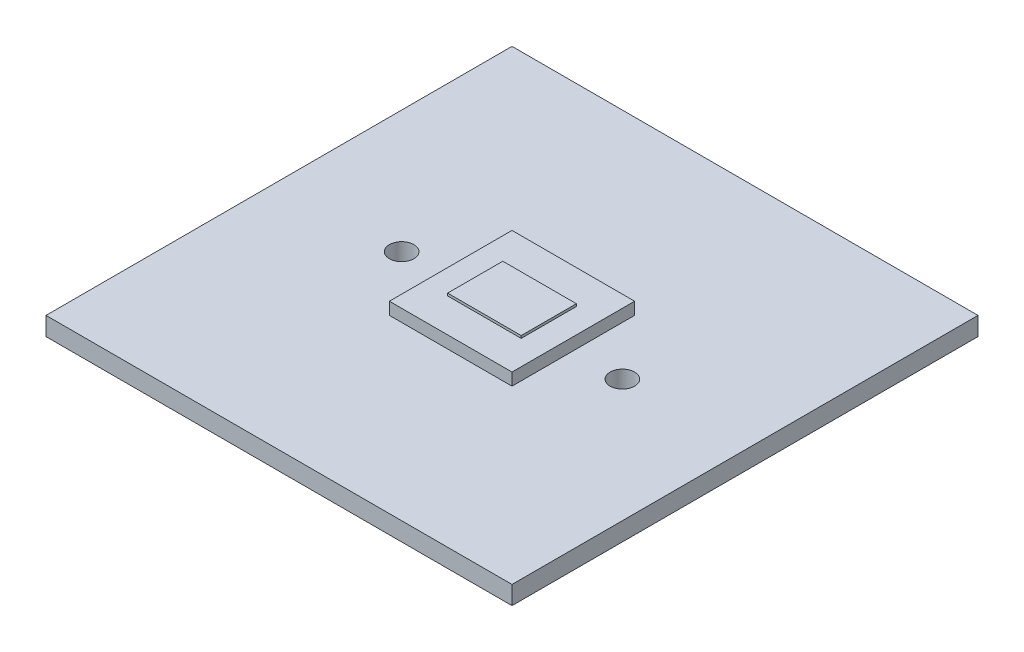
ISO-10303-21;
HEADER;
FILE_DESCRIPTION(('STEP AP214'),'2;1');
FILE_NAME('part.step','',(''),(''),'','','');
FILE_SCHEMA(('AUTOMOTIVE_DESIGN { 1 0 10303 214 1 1 1 1 }'));
ENDSEC;
DATA;
#1=APPLICATION_CONTEXT('core data for automotive mechanical design processes');
#2=APPLICATION_PROTOCOL_DEFINITION('international standard','automotive_design',2000,#1);
#3=PRODUCT_CONTEXT('',#1,'mechanical');
#4=PRODUCT('Part','Part','',(#3));
#5=PRODUCT_RELATED_PRODUCT_CATEGORY('part','',(#4));
#6=PRODUCT_DEFINITION_FORMATION('','',#4);
#7=PRODUCT_DEFINITION_CONTEXT('part definition',#1,'design');
#8=PRODUCT_DEFINITION('design','',#6,#7);
#9=PRODUCT_DEFINITION_SHAPE('','',#8);
#10=(LENGTH_UNIT() NAMED_UNIT(*) SI_UNIT(.MILLI.,.METRE.));
#11=(NAMED_UNIT(*) PLANE_ANGLE_UNIT() SI_UNIT($,.RADIAN.));
#12=(NAMED_UNIT(*) SI_UNIT($,.STERADIAN.) SOLID_ANGLE_UNIT());
#13=UNCERTAINTY_MEASURE_WITH_UNIT(LENGTH_MEASURE(1.E-05),#10,'distance_accuracy_value','');
#14=(GEOMETRIC_REPRESENTATION_CONTEXT(3) GLOBAL_UNCERTAINTY_ASSIGNED_CONTEXT((#13)) GLOBAL_UNIT_ASSIGNED_CONTEXT((#10,
#11,#12)) REPRESENTATION_CONTEXT('',''));
#15=CARTESIAN_POINT('',(0.,0.,0.));
#16=DIRECTION('',(0.,0.,1.));
#17=DIRECTION('',(1.,0.,0.));
#18=AXIS2_PLACEMENT_3D('',#15,#16,#17);
#19=CARTESIAN_POINT('',(0.,1.,0.));
#20=DIRECTION('',(0.,-1.,0.));
#21=DIRECTION('',(0.,0.,-1.));
#22=AXIS2_PLACEMENT_3D('',#19,#20,#21);
#23=PLANE('',#22);
#24=DIRECTION('',(0.,0.,-1.));
#25=VECTOR('',#24,1.);
#26=CARTESIAN_POINT('',(5.,1.,5.));
#27=LINE('',#26,#25);
#28=CARTESIAN_POINT('',(5.,1.,5.));
#29=VERTEX_POINT('',#28);
#30=CARTESIAN_POINT('',(5.,1.,-5.));
#31=VERTEX_POINT('',#30);
#32=EDGE_CURVE('E183',#29,#31,#27,.T.);
#33=ORIENTED_EDGE('',*,*,#32,.T.);
#34=DIRECTION('',(-1.,0.,0.));
#35=VECTOR('',#34,1.);
#36=CARTESIAN_POINT('',(-5.,1.,-5.));
#37=LINE('',#36,#35);
#38=CARTESIAN_POINT('',(-5.,1.,-5.));
#39=VERTEX_POINT('',#38);
#40=EDGE_CURVE('E186',#31,#39,#37,.T.);
#41=ORIENTED_EDGE('',*,*,#40,.T.);
#42=DIRECTION('',(0.,0.,1.));
#43=VECTOR('',#42,1.);
#44=CARTESIAN_POINT('',(-5.,1.,5.));
#45=LINE('',#44,#43);
#46=CARTESIAN_POINT('',(-5.,1.,5.));
#47=VERTEX_POINT('',#46);
#48=EDGE_CURVE('E189',#39,#47,#45,.T.);
#49=ORIENTED_EDGE('',*,*,#48,.T.);
#50=DIRECTION('',(1.,0.,0.));
#51=VECTOR('',#50,1.);
#52=CARTESIAN_POINT('',(-5.,1.,5.));
#53=LINE('',#52,#51);
#54=EDGE_CURVE('E191',#47,#29,#53,.T.);
#55=ORIENTED_EDGE('',*,*,#54,.T.);
#56=EDGE_LOOP('',(#33,#41,#49,#55));
#57=FACE_BOUND('',#56,.T.);
#58=DIRECTION('',(0.,0.,-1.));
#59=VECTOR('',#58,1.);
#60=CARTESIAN_POINT('',(3.,1.,2.25));
#61=LINE('',#60,#59);
#62=CARTESIAN_POINT('',(3.,1.,2.25));
#63=VERTEX_POINT('',#62);
#64=CARTESIAN_POINT('',(3.,1.,-2.25));
#65=VERTEX_POINT('',#64);
#66=EDGE_CURVE('E149',#63,#65,#61,.T.);
#67=ORIENTED_EDGE('',*,*,#66,.F.);
#68=DIRECTION('',(1.,0.,0.));
#69=VECTOR('',#68,1.);
#70=CARTESIAN_POINT('',(-3.,1.,2.25));
#71=LINE('',#70,#69);
#72=CARTESIAN_POINT('',(-3.,1.,2.25));
#73=VERTEX_POINT('',#72);
#74=EDGE_CURVE('E161',#73,#63,#71,.T.);
#75=ORIENTED_EDGE('',*,*,#74,.F.);
#76=DIRECTION('',(0.,0.,1.));
#77=VECTOR('',#76,1.);
#78=CARTESIAN_POINT('',(-3.,1.,2.25));
#79=LINE('',#78,#77);
#80=CARTESIAN_POINT('',(-3.,1.,-2.25));
#81=VERTEX_POINT('',#80);
#82=EDGE_CURVE('E57',#81,#73,#79,.T.);
#83=ORIENTED_EDGE('',*,*,#82,.F.);
#84=DIRECTION('',(-1.,0.,0.));
#85=VECTOR('',#84,1.);
#86=CARTESIAN_POINT('',(-3.,1.,-2.25));
#87=LINE('',#86,#85);
#88=EDGE_CURVE('E52',#65,#81,#87,.T.);
#89=ORIENTED_EDGE('',*,*,#88,.F.);
#90=EDGE_LOOP('',(#67,#75,#83,#89));
#91=FACE_BOUND('',#90,.T.);
#92=ADVANCED_FACE('F37',(#57,#91),#23,.F.);
#93=CARTESIAN_POINT('',(5.,1.,5.));
#94=DIRECTION('',(-1.,0.,0.));
#95=DIRECTION('',(0.,0.,1.));
#96=AXIS2_PLACEMENT_3D('',#93,#94,#95);
#97=PLANE('',#96);
#98=DIRECTION('',(0.,0.,-1.));
#99=VECTOR('',#98,1.);
#100=CARTESIAN_POINT('',(5.,0.,5.));
#101=LINE('',#100,#99);
#102=CARTESIAN_POINT('',(5.,0.,5.));
#103=VERTEX_POINT('',#102);
#104=CARTESIAN_POINT('',(5.,0.,-5.));
#105=VERTEX_POINT('',#104);
#106=EDGE_CURVE('E182',#103,#105,#101,.T.);
#107=ORIENTED_EDGE('',*,*,#106,.T.);
#108=DIRECTION('',(0.,-1.,0.));
#109=VECTOR('',#108,1.);
#110=CARTESIAN_POINT('',(5.,1.,-5.));
#111=LINE('',#110,#109);
#112=EDGE_CURVE('E11',#31,#105,#111,.T.);
#113=ORIENTED_EDGE('',*,*,#112,.F.);
#114=ORIENTED_EDGE('',*,*,#32,.F.);
#115=DIRECTION('',(0.,-1.,0.));
#116=VECTOR('',#115,1.);
#117=CARTESIAN_POINT('',(5.,1.,5.));
#118=LINE('',#117,#116);
#119=EDGE_CURVE('E193',#29,#103,#118,.T.);
#120=ORIENTED_EDGE('',*,*,#119,.T.);
#121=EDGE_LOOP('',(#107,#113,#114,#120));
#122=FACE_BOUND('',#121,.T.);
#123=ADVANCED_FACE('F39',(#122),#97,.F.);
#124=CARTESIAN_POINT('',(-5.,1.,-5.));
#125=DIRECTION('',(0.,0.,1.));
#126=DIRECTION('',(1.,0.,0.));
#127=AXIS2_PLACEMENT_3D('',#124,#125,#126);
#128=PLANE('',#127);
#129=DIRECTION('',(-1.,0.,0.));
#130=VECTOR('',#129,1.);
#131=CARTESIAN_POINT('',(-5.,0.,-5.));
#132=LINE('',#131,#130);
#133=CARTESIAN_POINT('',(-5.,0.,-5.));
#134=VERTEX_POINT('',#133);
#135=EDGE_CURVE('E196',#105,#134,#132,.T.);
#136=ORIENTED_EDGE('',*,*,#135,.T.);
#137=DIRECTION('',(0.,-1.,0.));
#138=VECTOR('',#137,1.);
#139=CARTESIAN_POINT('',(-5.,1.,-5.));
#140=LINE('',#139,#138);
#141=EDGE_CURVE('E45',#39,#134,#140,.T.);
#142=ORIENTED_EDGE('',*,*,#141,.F.);
#143=ORIENTED_EDGE('',*,*,#40,.F.);
#144=ORIENTED_EDGE('',*,*,#112,.T.);
#145=EDGE_LOOP('',(#136,#142,#143,#144));
#146=FACE_BOUND('',#145,.T.);
#147=ADVANCED_FACE('F215',(#146),#128,.F.);
#148=CARTESIAN_POINT('',(-5.,1.,5.));
#149=DIRECTION('',(1.,0.,0.));
#150=DIRECTION('',(0.,0.,-1.));
#151=AXIS2_PLACEMENT_3D('',#148,#149,#150);
#152=PLANE('',#151);
#153=DIRECTION('',(0.,0.,1.));
#154=VECTOR('',#153,1.);
#155=CARTESIAN_POINT('',(-5.,0.,5.));
#156=LINE('',#155,#154);
#157=CARTESIAN_POINT('',(-5.,0.,5.));
#158=VERTEX_POINT('',#157);
#159=EDGE_CURVE('E199',#134,#158,#156,.T.);
#160=ORIENTED_EDGE('',*,*,#159,.T.);
#161=DIRECTION('',(0.,-1.,0.));
#162=VECTOR('',#161,1.);
#163=CARTESIAN_POINT('',(-5.,1.,5.));
#164=LINE('',#163,#162);
#165=EDGE_CURVE('E206',#47,#158,#164,.T.);
#166=ORIENTED_EDGE('',*,*,#165,.F.);
#167=ORIENTED_EDGE('',*,*,#48,.F.);
#168=ORIENTED_EDGE('',*,*,#141,.T.);
#169=EDGE_LOOP('',(#160,#166,#167,#168));
#170=FACE_BOUND('',#169,.T.);
#171=ADVANCED_FACE('F212',(#170),#152,.F.);
#172=CARTESIAN_POINT('',(-5.,1.,5.));
#173=DIRECTION('',(0.,0.,-1.));
#174=DIRECTION('',(-1.,0.,0.));
#175=AXIS2_PLACEMENT_3D('',#172,#173,#174);
#176=PLANE('',#175);
#177=DIRECTION('',(1.,0.,0.));
#178=VECTOR('',#177,1.);
#179=CARTESIAN_POINT('',(-5.,0.,5.));
#180=LINE('',#179,#178);
#181=EDGE_CURVE('E187',#158,#103,#180,.T.);
#182=ORIENTED_EDGE('',*,*,#181,.T.);
#183=ORIENTED_EDGE('',*,*,#119,.F.);
#184=ORIENTED_EDGE('',*,*,#54,.F.);
#185=ORIENTED_EDGE('',*,*,#165,.T.);
#186=EDGE_LOOP('',(#182,#183,#184,#185));
#187=FACE_BOUND('',#186,.T.);
#188=ADVANCED_FACE('F221',(#187),#176,.F.);
#189=CARTESIAN_POINT('',(3.,1.2,2.25));
#190=DIRECTION('',(-1.,0.,0.));
#191=DIRECTION('',(0.,0.,1.));
#192=AXIS2_PLACEMENT_3D('',#189,#190,#191);
#193=PLANE('',#192);
#194=ORIENTED_EDGE('',*,*,#66,.T.);
#195=DIRECTION('',(0.,-1.,0.));
#196=VECTOR('',#195,1.);
#197=CARTESIAN_POINT('',(3.,1.2,-2.25));
#198=LINE('',#197,#196);
#199=CARTESIAN_POINT('',(3.,1.2,-2.25));
#200=VERTEX_POINT('',#199);
#201=EDGE_CURVE('E180',#200,#65,#198,.T.);
#202=ORIENTED_EDGE('',*,*,#201,.F.);
#203=DIRECTION('',(0.,0.,-1.));
#204=VECTOR('',#203,1.);
#205=CARTESIAN_POINT('',(3.,1.2,2.25));
#206=LINE('',#205,#204);
#207=CARTESIAN_POINT('',(3.,1.2,2.25));
#208=VERTEX_POINT('',#207);
#209=EDGE_CURVE('E157',#208,#200,#206,.T.);
#210=ORIENTED_EDGE('',*,*,#209,.F.);
#211=DIRECTION('',(0.,-1.,0.));
#212=VECTOR('',#211,1.);
#213=CARTESIAN_POINT('',(3.,1.2,2.25));
#214=LINE('',#213,#212);
#215=EDGE_CURVE('E166',#208,#63,#214,.T.);
#216=ORIENTED_EDGE('',*,*,#215,.T.);
#217=EDGE_LOOP('',(#194,#202,#210,#216));
#218=FACE_BOUND('',#217,.T.);
#219=ADVANCED_FACE('F236',(#218),#193,.F.);
#220=CARTESIAN_POINT('',(-3.,1.2,-2.25));
#221=DIRECTION('',(0.,0.,1.));
#222=DIRECTION('',(1.,0.,0.));
#223=AXIS2_PLACEMENT_3D('',#220,#221,#222);
#224=PLANE('',#223);
#225=ORIENTED_EDGE('',*,*,#88,.T.);
#226=DIRECTION('',(0.,-1.,0.));
#227=VECTOR('',#226,1.);
#228=CARTESIAN_POINT('',(-3.,1.2,-2.25));
#229=LINE('',#228,#227);
#230=CARTESIAN_POINT('',(-3.,1.2,-2.25));
#231=VERTEX_POINT('',#230);
#232=EDGE_CURVE('E177',#231,#81,#229,.T.);
#233=ORIENTED_EDGE('',*,*,#232,.F.);
#234=DIRECTION('',(-1.,0.,0.));
#235=VECTOR('',#234,1.);
#236=CARTESIAN_POINT('',(-3.,1.2,-2.25));
#237=LINE('',#236,#235);
#238=EDGE_CURVE('E160',#200,#231,#237,.T.);
#239=ORIENTED_EDGE('',*,*,#238,.F.);
#240=ORIENTED_EDGE('',*,*,#201,.T.);
#241=EDGE_LOOP('',(#225,#233,#239,#240));
#242=FACE_BOUND('',#241,.T.);
#243=ADVANCED_FACE('F244',(#242),#224,.F.);
#244=CARTESIAN_POINT('',(-3.,1.2,2.25));
#245=DIRECTION('',(1.,0.,0.));
#246=DIRECTION('',(0.,0.,-1.));
#247=AXIS2_PLACEMENT_3D('',#244,#245,#246);
#248=PLANE('',#247);
#249=ORIENTED_EDGE('',*,*,#82,.T.);
#250=DIRECTION('',(0.,-1.,0.));
#251=VECTOR('',#250,1.);
#252=CARTESIAN_POINT('',(-3.,1.2,2.25));
#253=LINE('',#252,#251);
#254=CARTESIAN_POINT('',(-3.,1.2,2.25));
#255=VERTEX_POINT('',#254);
#256=EDGE_CURVE('E174',#255,#73,#253,.T.);
#257=ORIENTED_EDGE('',*,*,#256,.F.);
#258=DIRECTION('',(0.,0.,1.));
#259=VECTOR('',#258,1.);
#260=CARTESIAN_POINT('',(-3.,1.2,2.25));
#261=LINE('',#260,#259);
#262=EDGE_CURVE('E163',#231,#255,#261,.T.);
#263=ORIENTED_EDGE('',*,*,#262,.F.);
#264=ORIENTED_EDGE('',*,*,#232,.T.);
#265=EDGE_LOOP('',(#249,#257,#263,#264));
#266=FACE_BOUND('',#265,.T.);
#267=ADVANCED_FACE('F242',(#266),#248,.F.);
#268=CARTESIAN_POINT('',(-3.,1.2,2.25));
#269=DIRECTION('',(0.,0.,-1.));
#270=DIRECTION('',(-1.,0.,0.));
#271=AXIS2_PLACEMENT_3D('',#268,#269,#270);
#272=PLANE('',#271);
#273=ORIENTED_EDGE('',*,*,#74,.T.);
#274=ORIENTED_EDGE('',*,*,#215,.F.);
#275=DIRECTION('',(1.,0.,0.));
#276=VECTOR('',#275,1.);
#277=CARTESIAN_POINT('',(-3.,1.2,2.25));
#278=LINE('',#277,#276);
#279=EDGE_CURVE('E165',#255,#208,#278,.T.);
#280=ORIENTED_EDGE('',*,*,#279,.F.);
#281=ORIENTED_EDGE('',*,*,#256,.T.);
#282=EDGE_LOOP('',(#273,#274,#280,#281));
#283=FACE_BOUND('',#282,.T.);
#284=ADVANCED_FACE('F232',(#283),#272,.F.);
#285=CARTESIAN_POINT('',(0.,1.2,0.));
#286=DIRECTION('',(0.,-1.,0.));
#287=DIRECTION('',(0.,0.,-1.));
#288=AXIS2_PLACEMENT_3D('',#285,#286,#287);
#289=PLANE('',#288);
#290=ORIENTED_EDGE('',*,*,#209,.T.);
#291=ORIENTED_EDGE('',*,*,#238,.T.);
#292=ORIENTED_EDGE('',*,*,#262,.T.);
#293=ORIENTED_EDGE('',*,*,#279,.T.);
#294=EDGE_LOOP('',(#290,#291,#292,#293));
#295=FACE_BOUND('',#294,.T.);
#296=ADVANCED_FACE('F238',(#295),#289,.F.);
#297=CARTESIAN_POINT('',(0.,0.,0.));
#298=DIRECTION('',(0.,-1.,0.));
#299=DIRECTION('',(0.,0.,-1.));
#300=AXIS2_PLACEMENT_3D('',#297,#298,#299);
#301=PLANE('',#300);
#302=CARTESIAN_POINT('',(-9.,0.,0.));
#303=DIRECTION('',(0.,1.,0.));
#304=DIRECTION('',(0.,0.,1.));
#305=AXIS2_PLACEMENT_3D('',#302,#303,#304);
#306=CIRCLE('',#305,1.);
#307=CARTESIAN_POINT('',(-9.,0.,1.));
#308=VERTEX_POINT('',#307);
#309=EDGE_CURVE('E409',#308,#308,#306,.T.);
#310=ORIENTED_EDGE('',*,*,#309,.F.);
#311=EDGE_LOOP('',(#310));
#312=FACE_BOUND('',#311,.T.);
#313=CARTESIAN_POINT('',(9.,0.,0.));
#314=DIRECTION('',(0.,1.,0.));
#315=DIRECTION('',(0.,0.,1.));
#316=AXIS2_PLACEMENT_3D('',#313,#314,#315);
#317=CIRCLE('',#316,1.);
#318=CARTESIAN_POINT('',(9.,0.,1.));
#319=VERTEX_POINT('',#318);
#320=EDGE_CURVE('E411',#319,#319,#317,.T.);
#321=ORIENTED_EDGE('',*,*,#320,.F.);
#322=EDGE_LOOP('',(#321));
#323=FACE_BOUND('',#322,.T.);
#324=DIRECTION('',(0.,0.,1.));
#325=VECTOR('',#324,1.);
#326=CARTESIAN_POINT('',(19.,0.,19.));
#327=LINE('',#326,#325);
#328=CARTESIAN_POINT('',(19.,0.,-19.));
#329=VERTEX_POINT('',#328);
#330=CARTESIAN_POINT('',(19.,0.,19.));
#331=VERTEX_POINT('',#330);
#332=EDGE_CURVE('E148',#329,#331,#327,.T.);
#333=ORIENTED_EDGE('',*,*,#332,.F.);
#334=DIRECTION('',(1.,0.,0.));
#335=VECTOR('',#334,1.);
#336=CARTESIAN_POINT('',(-19.,0.,-19.));
#337=LINE('',#336,#335);
#338=CARTESIAN_POINT('',(-19.,0.,-19.));
#339=VERTEX_POINT('',#338);
#340=EDGE_CURVE('E144',#339,#329,#337,.T.);
#341=ORIENTED_EDGE('',*,*,#340,.F.);
#342=DIRECTION('',(0.,0.,-1.));
#343=VECTOR('',#342,1.);
#344=CARTESIAN_POINT('',(-19.,0.,19.));
#345=LINE('',#344,#343);
#346=CARTESIAN_POINT('',(-19.,0.,19.));
#347=VERTEX_POINT('',#346);
#348=EDGE_CURVE('E425',#347,#339,#345,.T.);
#349=ORIENTED_EDGE('',*,*,#348,.F.);
#350=DIRECTION('',(-1.,0.,0.));
#351=VECTOR('',#350,1.);
#352=CARTESIAN_POINT('',(-19.,0.,19.));
#353=LINE('',#352,#351);
#354=EDGE_CURVE('E423',#331,#347,#353,.T.);
#355=ORIENTED_EDGE('',*,*,#354,.F.);
#356=EDGE_LOOP('',(#333,#341,#349,#355));
#357=FACE_BOUND('',#356,.T.);
#358=ORIENTED_EDGE('',*,*,#135,.F.);
#359=ORIENTED_EDGE('',*,*,#106,.F.);
#360=ORIENTED_EDGE('',*,*,#181,.F.);
#361=ORIENTED_EDGE('',*,*,#159,.F.);
#362=EDGE_LOOP('',(#358,#359,#360,#361));
#363=FACE_BOUND('',#362,.T.);
#364=ADVANCED_FACE('F218',(#312,#323,#357,#363),#301,.F.);
#365=CARTESIAN_POINT('',(19.,-1.5,19.));
#366=DIRECTION('',(-1.,0.,0.));
#367=DIRECTION('',(0.,0.,1.));
#368=AXIS2_PLACEMENT_3D('',#365,#366,#367);
#369=PLANE('',#368);
#370=ORIENTED_EDGE('',*,*,#332,.T.);
#371=DIRECTION('',(0.,1.,0.));
#372=VECTOR('',#371,1.);
#373=CARTESIAN_POINT('',(19.,-1.5,19.));
#374=LINE('',#373,#372);
#375=CARTESIAN_POINT('',(19.,-1.5,19.));
#376=VERTEX_POINT('',#375);
#377=EDGE_CURVE('E128',#376,#331,#374,.T.);
#378=ORIENTED_EDGE('',*,*,#377,.F.);
#379=DIRECTION('',(0.,0.,1.));
#380=VECTOR('',#379,1.);
#381=CARTESIAN_POINT('',(19.,-1.5,19.));
#382=LINE('',#381,#380);
#383=CARTESIAN_POINT('',(19.,-1.5,-19.));
#384=VERTEX_POINT('',#383);
#385=EDGE_CURVE('E135',#384,#376,#382,.T.);
#386=ORIENTED_EDGE('',*,*,#385,.F.);
#387=DIRECTION('',(0.,1.,0.));
#388=VECTOR('',#387,1.);
#389=CARTESIAN_POINT('',(19.,-1.5,-19.));
#390=LINE('',#389,#388);
#391=EDGE_CURVE('E421',#384,#329,#390,.T.);
#392=ORIENTED_EDGE('',*,*,#391,.T.);
#393=EDGE_LOOP('',(#370,#378,#386,#392));
#394=FACE_BOUND('',#393,.T.);
#395=ADVANCED_FACE('F146',(#394),#369,.F.);
#396=CARTESIAN_POINT('',(-19.,-1.5,19.));
#397=DIRECTION('',(0.,0.,-1.));
#398=DIRECTION('',(-1.,0.,0.));
#399=AXIS2_PLACEMENT_3D('',#396,#397,#398);
#400=PLANE('',#399);
#401=ORIENTED_EDGE('',*,*,#354,.T.);
#402=DIRECTION('',(0.,1.,0.));
#403=VECTOR('',#402,1.);
#404=CARTESIAN_POINT('',(-19.,-1.5,19.));
#405=LINE('',#404,#403);
#406=CARTESIAN_POINT('',(-19.,-1.5,19.));
#407=VERTEX_POINT('',#406);
#408=EDGE_CURVE('E131',#407,#347,#405,.T.);
#409=ORIENTED_EDGE('',*,*,#408,.F.);
#410=DIRECTION('',(-1.,0.,0.));
#411=VECTOR('',#410,1.);
#412=CARTESIAN_POINT('',(-19.,-1.5,19.));
#413=LINE('',#412,#411);
#414=EDGE_CURVE('E124',#376,#407,#413,.T.);
#415=ORIENTED_EDGE('',*,*,#414,.F.);
#416=ORIENTED_EDGE('',*,*,#377,.T.);
#417=EDGE_LOOP('',(#401,#409,#415,#416));
#418=FACE_BOUND('',#417,.T.);
#419=ADVANCED_FACE('F126',(#418),#400,.F.);
#420=CARTESIAN_POINT('',(-19.,-1.5,19.));
#421=DIRECTION('',(1.,0.,0.));
#422=DIRECTION('',(0.,0.,-1.));
#423=AXIS2_PLACEMENT_3D('',#420,#421,#422);
#424=PLANE('',#423);
#425=ORIENTED_EDGE('',*,*,#348,.T.);
#426=DIRECTION('',(0.,1.,0.));
#427=VECTOR('',#426,1.);
#428=CARTESIAN_POINT('',(-19.,-1.5,-19.));
#429=LINE('',#428,#427);
#430=CARTESIAN_POINT('',(-19.,-1.5,-19.));
#431=VERTEX_POINT('',#430);
#432=EDGE_CURVE('E153',#431,#339,#429,.T.);
#433=ORIENTED_EDGE('',*,*,#432,.F.);
#434=DIRECTION('',(0.,0.,-1.));
#435=VECTOR('',#434,1.);
#436=CARTESIAN_POINT('',(-19.,-1.5,19.));
#437=LINE('',#436,#435);
#438=EDGE_CURVE('E134',#407,#431,#437,.T.);
#439=ORIENTED_EDGE('',*,*,#438,.F.);
#440=ORIENTED_EDGE('',*,*,#408,.T.);
#441=EDGE_LOOP('',(#425,#433,#439,#440));
#442=FACE_BOUND('',#441,.T.);
#443=ADVANCED_FACE('F311',(#442),#424,.F.);
#444=CARTESIAN_POINT('',(-19.,-1.5,-19.));
#445=DIRECTION('',(0.,0.,1.));
#446=DIRECTION('',(1.,0.,0.));
#447=AXIS2_PLACEMENT_3D('',#444,#445,#446);
#448=PLANE('',#447);
#449=ORIENTED_EDGE('',*,*,#340,.T.);
#450=ORIENTED_EDGE('',*,*,#391,.F.);
#451=DIRECTION('',(1.,0.,0.));
#452=VECTOR('',#451,1.);
#453=CARTESIAN_POINT('',(-19.,-1.5,-19.));
#454=LINE('',#453,#452);
#455=EDGE_CURVE('E140',#431,#384,#454,.T.);
#456=ORIENTED_EDGE('',*,*,#455,.F.);
#457=ORIENTED_EDGE('',*,*,#432,.T.);
#458=EDGE_LOOP('',(#449,#450,#456,#457));
#459=FACE_BOUND('',#458,.T.);
#460=ADVANCED_FACE('F318',(#459),#448,.F.);
#461=CARTESIAN_POINT('',(0.,-1.5,0.));
#462=DIRECTION('',(0.,-1.,0.));
#463=DIRECTION('',(0.,0.,-1.));
#464=AXIS2_PLACEMENT_3D('',#461,#462,#463);
#465=PLANE('',#464);
#466=CARTESIAN_POINT('',(-9.,-1.5,0.));
#467=DIRECTION('',(0.,1.,0.));
#468=DIRECTION('',(0.,0.,1.));
#469=AXIS2_PLACEMENT_3D('',#466,#467,#468);
#470=CIRCLE('',#469,1.);
#471=CARTESIAN_POINT('',(-9.,-1.5,1.));
#472=VERTEX_POINT('',#471);
#473=EDGE_CURVE('E406',#472,#472,#470,.T.);
#474=ORIENTED_EDGE('',*,*,#473,.T.);
#475=EDGE_LOOP('',(#474));
#476=FACE_BOUND('',#475,.T.);
#477=CARTESIAN_POINT('',(9.,-1.5,0.));
#478=DIRECTION('',(0.,1.,0.));
#479=DIRECTION('',(0.,0.,1.));
#480=AXIS2_PLACEMENT_3D('',#477,#478,#479);
#481=CIRCLE('',#480,1.);
#482=CARTESIAN_POINT('',(9.,-1.5,1.));
#483=VERTEX_POINT('',#482);
#484=EDGE_CURVE('E414',#483,#483,#481,.T.);
#485=ORIENTED_EDGE('',*,*,#484,.T.);
#486=EDGE_LOOP('',(#485));
#487=FACE_BOUND('',#486,.T.);
#488=ORIENTED_EDGE('',*,*,#385,.T.);
#489=ORIENTED_EDGE('',*,*,#414,.T.);
#490=ORIENTED_EDGE('',*,*,#438,.T.);
#491=ORIENTED_EDGE('',*,*,#455,.T.);
#492=EDGE_LOOP('',(#488,#489,#490,#491));
#493=FACE_BOUND('',#492,.T.);
#494=ADVANCED_FACE('F138',(#476,#487,#493),#465,.T.);
#495=CARTESIAN_POINT('',(9.,-1.5,0.));
#496=DIRECTION('',(0.,1.,0.));
#497=DIRECTION('',(0.,0.,1.));
#498=AXIS2_PLACEMENT_3D('',#495,#496,#497);
#499=CYLINDRICAL_SURFACE('',#498,1.);
#500=ORIENTED_EDGE('',*,*,#484,.F.);
#501=EDGE_LOOP('',(#500));
#502=FACE_BOUND('',#501,.T.);
#503=ORIENTED_EDGE('',*,*,#320,.T.);
#504=EDGE_LOOP('',(#503));
#505=FACE_BOUND('',#504,.T.);
#506=ADVANCED_FACE('F331',(#502,#505),#499,.F.);
#507=CARTESIAN_POINT('',(-9.,-1.5,0.));
#508=DIRECTION('',(0.,1.,0.));
#509=DIRECTION('',(0.,0.,1.));
#510=AXIS2_PLACEMENT_3D('',#507,#508,#509);
#511=CYLINDRICAL_SURFACE('',#510,1.);
#512=ORIENTED_EDGE('',*,*,#473,.F.);
#513=EDGE_LOOP('',(#512));
#514=FACE_BOUND('',#513,.T.);
#515=ORIENTED_EDGE('',*,*,#309,.T.);
#516=EDGE_LOOP('',(#515));
#517=FACE_BOUND('',#516,.T.);
#518=ADVANCED_FACE('F339',(#514,#517),#511,.F.);
#519=CLOSED_SHELL('',(#92,#123,#147,#171,#188,#219,#243,#267,#284,#296,#364,#395,#419,#443,#460,
#494,#506,#518));
#520=MANIFOLD_SOLID_BREP('B2',#519);
#521=ADVANCED_BREP_SHAPE_REPRESENTATION('',(#18,#520),#14);
#522=SHAPE_DEFINITION_REPRESENTATION(#9,#521);
ENDSEC;
END-ISO-10303-21;
